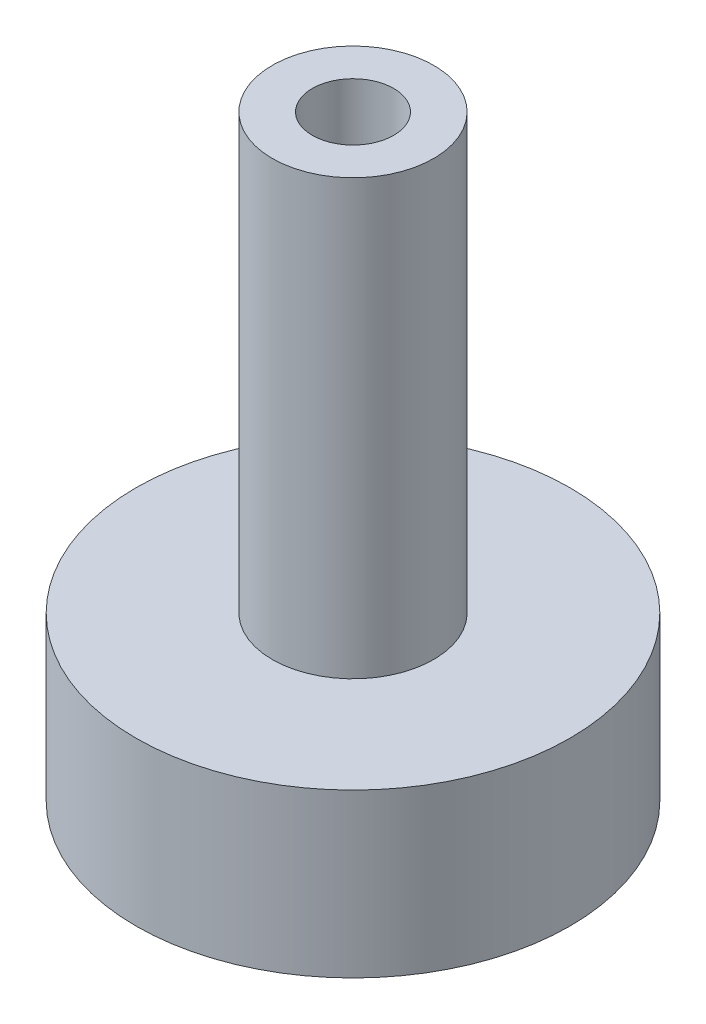
ISO-10303-21;
HEADER;
FILE_DESCRIPTION(('STEP AP214'),'2;1');
FILE_NAME('part.step','',(''),(''),'','','');
FILE_SCHEMA(('AUTOMOTIVE_DESIGN { 1 0 10303 214 1 1 1 1 }'));
ENDSEC;
DATA;
#1=APPLICATION_CONTEXT('core data for automotive mechanical design processes');
#2=APPLICATION_PROTOCOL_DEFINITION('international standard','automotive_design',2000,#1);
#3=PRODUCT_CONTEXT('',#1,'mechanical');
#4=PRODUCT('Part','Part','',(#3));
#5=PRODUCT_RELATED_PRODUCT_CATEGORY('part','',(#4));
#6=PRODUCT_DEFINITION_FORMATION('','',#4);
#7=PRODUCT_DEFINITION_CONTEXT('part definition',#1,'design');
#8=PRODUCT_DEFINITION('design','',#6,#7);
#9=PRODUCT_DEFINITION_SHAPE('','',#8);
#10=(LENGTH_UNIT() NAMED_UNIT(*) SI_UNIT(.MILLI.,.METRE.));
#11=(NAMED_UNIT(*) PLANE_ANGLE_UNIT() SI_UNIT($,.RADIAN.));
#12=(NAMED_UNIT(*) SI_UNIT($,.STERADIAN.) SOLID_ANGLE_UNIT());
#13=UNCERTAINTY_MEASURE_WITH_UNIT(LENGTH_MEASURE(1.E-05),#10,'distance_accuracy_value','');
#14=(GEOMETRIC_REPRESENTATION_CONTEXT(3) GLOBAL_UNCERTAINTY_ASSIGNED_CONTEXT((#13)) GLOBAL_UNIT_ASSIGNED_CONTEXT((#10,
#11,#12)) REPRESENTATION_CONTEXT('',''));
#15=CARTESIAN_POINT('',(0.,0.,0.));
#16=DIRECTION('',(0.,0.,1.));
#17=DIRECTION('',(1.,0.,0.));
#18=AXIS2_PLACEMENT_3D('',#15,#16,#17);
#19=CARTESIAN_POINT('',(-27.9181268796598,4.7625,5.99101435185832));
#20=DIRECTION('',(0.,-1.,0.));
#21=DIRECTION('',(0.,0.,-1.));
#22=AXIS2_PLACEMENT_3D('',#19,#20,#21);
#23=CYLINDRICAL_SURFACE('',#22,6.35);
#24=CARTESIAN_POINT('',(-27.9181268796598,4.7625,5.99101435185832));
#25=DIRECTION('',(0.,1.,0.));
#26=DIRECTION('',(0.,0.,1.));
#27=AXIS2_PLACEMENT_3D('',#24,#25,#26);
#28=CIRCLE('',#27,6.35);
#29=CARTESIAN_POINT('',(-27.9181268796598,4.7625,-0.358985648141679));
#30=VERTEX_POINT('',#29);
#31=EDGE_CURVE('E45',#30,#30,#28,.T.);
#32=CARTESIAN_POINT('',(-27.9181268796598,0.,5.99101435185832));
#33=DIRECTION('',(0.,1.,0.));
#34=DIRECTION('',(0.,0.,1.));
#35=AXIS2_PLACEMENT_3D('',#32,#33,#34);
#36=CIRCLE('',#35,6.35);
#37=CARTESIAN_POINT('',(-27.9181268796598,0.,-0.358985648141679));
#38=VERTEX_POINT('',#37);
#39=EDGE_CURVE('E40',#38,#38,#36,.T.);
#40=CARTESIAN_POINT('',(-27.9181268796598,4.7625,-0.358985648141679));
#41=CARTESIAN_POINT('',(-27.9181268796598,4.712890625,-0.358985648141679));
#42=CARTESIAN_POINT('',(-27.9181268796598,4.66328125,-0.358985648141679));
#43=CARTESIAN_POINT('',(-27.9181268796598,4.5640625,-0.358985648141679));
#44=CARTESIAN_POINT('',(-27.9181268796598,4.514453125,-0.358985648141679));
#45=CARTESIAN_POINT('',(-27.9181268796598,4.415234375,-0.358985648141679));
#46=CARTESIAN_POINT('',(-27.9181268796598,4.365625,-0.358985648141679));
#47=CARTESIAN_POINT('',(-27.9181268796598,4.26640625,-0.358985648141679));
#48=CARTESIAN_POINT('',(-27.9181268796598,4.216796875,-0.358985648141679));
#49=CARTESIAN_POINT('',(-27.9181268796598,4.117578125,-0.358985648141679));
#50=CARTESIAN_POINT('',(-27.9181268796598,4.06796875,-0.358985648141679));
#51=CARTESIAN_POINT('',(-27.9181268796598,3.96875,-0.358985648141679));
#52=CARTESIAN_POINT('',(-27.9181268796598,3.919140625,-0.358985648141679));
#53=CARTESIAN_POINT('',(-27.9181268796598,3.819921875,-0.358985648141679));
#54=CARTESIAN_POINT('',(-27.9181268796598,3.7703125,-0.358985648141679));
#55=CARTESIAN_POINT('',(-27.9181268796598,3.67109375,-0.358985648141679));
#56=CARTESIAN_POINT('',(-27.9181268796598,3.621484375,-0.358985648141679));
#57=CARTESIAN_POINT('',(-27.9181268796598,3.522265625,-0.358985648141679));
#58=CARTESIAN_POINT('',(-27.9181268796598,3.47265625,-0.358985648141679));
#59=CARTESIAN_POINT('',(-27.9181268796598,3.3734375,-0.358985648141679));
#60=CARTESIAN_POINT('',(-27.9181268796598,3.323828125,-0.358985648141679));
#61=CARTESIAN_POINT('',(-27.9181268796598,3.224609375,-0.358985648141679));
#62=CARTESIAN_POINT('',(-27.9181268796598,3.175,-0.358985648141679));
#63=CARTESIAN_POINT('',(-27.9181268796598,3.07578125,-0.358985648141679));
#64=CARTESIAN_POINT('',(-27.9181268796598,3.026171875,-0.358985648141679));
#65=CARTESIAN_POINT('',(-27.9181268796598,2.926953125,-0.358985648141679));
#66=CARTESIAN_POINT('',(-27.9181268796598,2.87734375,-0.358985648141679));
#67=CARTESIAN_POINT('',(-27.9181268796598,2.778125,-0.358985648141679));
#68=CARTESIAN_POINT('',(-27.9181268796598,2.728515625,-0.358985648141679));
#69=CARTESIAN_POINT('',(-27.9181268796598,2.629296875,-0.358985648141679));
#70=CARTESIAN_POINT('',(-27.9181268796598,2.5796875,-0.358985648141679));
#71=CARTESIAN_POINT('',(-27.9181268796598,2.48046875,-0.358985648141679));
#72=CARTESIAN_POINT('',(-27.9181268796598,2.430859375,-0.358985648141679));
#73=CARTESIAN_POINT('',(-27.9181268796598,2.331640625,-0.358985648141679));
#74=CARTESIAN_POINT('',(-27.9181268796598,2.28203125,-0.358985648141679));
#75=CARTESIAN_POINT('',(-27.9181268796598,2.1828125,-0.358985648141679));
#76=CARTESIAN_POINT('',(-27.9181268796598,2.133203125,-0.358985648141679));
#77=CARTESIAN_POINT('',(-27.9181268796598,2.033984375,-0.358985648141679));
#78=CARTESIAN_POINT('',(-27.9181268796598,1.984375,-0.358985648141679));
#79=CARTESIAN_POINT('',(-27.9181268796598,1.88515625,-0.358985648141679));
#80=CARTESIAN_POINT('',(-27.9181268796598,1.835546875,-0.358985648141679));
#81=CARTESIAN_POINT('',(-27.9181268796598,1.736328125,-0.358985648141679));
#82=CARTESIAN_POINT('',(-27.9181268796598,1.68671875,-0.358985648141679));
#83=CARTESIAN_POINT('',(-27.9181268796598,1.5875,-0.358985648141679));
#84=CARTESIAN_POINT('',(-27.9181268796598,1.537890625,-0.358985648141679));
#85=CARTESIAN_POINT('',(-27.9181268796598,1.438671875,-0.358985648141679));
#86=CARTESIAN_POINT('',(-27.9181268796598,1.3890625,-0.358985648141679));
#87=CARTESIAN_POINT('',(-27.9181268796598,1.28984375,-0.358985648141679));
#88=CARTESIAN_POINT('',(-27.9181268796598,1.240234375,-0.358985648141679));
#89=CARTESIAN_POINT('',(-27.9181268796598,1.141015625,-0.358985648141679));
#90=CARTESIAN_POINT('',(-27.9181268796598,1.09140625,-0.358985648141679));
#91=CARTESIAN_POINT('',(-27.9181268796598,0.992187499999999,-0.358985648141679));
#92=CARTESIAN_POINT('',(-27.9181268796598,0.942578124999999,-0.358985648141679));
#93=CARTESIAN_POINT('',(-27.9181268796598,0.843359375,-0.358985648141679));
#94=CARTESIAN_POINT('',(-27.9181268796598,0.79375,-0.358985648141679));
#95=CARTESIAN_POINT('',(-27.9181268796598,0.69453125,-0.358985648141679));
#96=CARTESIAN_POINT('',(-27.9181268796598,0.644921875,-0.358985648141679));
#97=CARTESIAN_POINT('',(-27.9181268796598,0.545703125,-0.358985648141679));
#98=CARTESIAN_POINT('',(-27.9181268796598,0.49609375,-0.358985648141679));
#99=CARTESIAN_POINT('',(-27.9181268796598,0.396875,-0.358985648141679));
#100=CARTESIAN_POINT('',(-27.9181268796598,0.347265625,-0.358985648141679));
#101=CARTESIAN_POINT('',(-27.9181268796598,0.248046875,-0.358985648141679));
#102=CARTESIAN_POINT('',(-27.9181268796598,0.1984375,-0.358985648141679));
#103=CARTESIAN_POINT('',(-27.9181268796598,0.09921875,-0.358985648141679));
#104=CARTESIAN_POINT('',(-27.9181268796598,0.049609375,-0.358985648141679));
#105=CARTESIAN_POINT('',(-27.9181268796598,0.,-0.358985648141679));
#106=B_SPLINE_CURVE_WITH_KNOTS('',3,(#40,#41,#42,#43,#44,#45,#46,#47,#48,#49,#50,#51,#52,#53,
#54,#55,#56,#57,#58,#59,#60,#61,#62,#63,#64,#65,#66,#67,#68,#69,#70,#71,#72,#73,#74,#75,#76,#77,
#78,#79,#80,#81,#82,#83,#84,#85,#86,#87,#88,#89,#90,#91,#92,#93,#94,#95,#96,#97,#98,#99,#100,
#101,#102,#103,#104,#105),.UNSPECIFIED.,.F.,.F.,(4,2,2,2,2,2,2,2,2,2,2,2,2,2,2,2,2,2,2,2,2,2,2,
2,2,2,2,2,2,2,2,2,4),(0.,0.148828125,0.29765625,0.446484375,0.5953125,0.744140625,
0.892968750000001,1.041796875,1.190625,1.339453125,1.48828125,1.637109375,1.7859375,1.934765625,
2.08359375,2.232421875,2.38125,2.530078125,2.67890625,2.827734375,2.9765625,3.125390625,
3.27421875,3.423046875,3.571875,3.720703125,3.86953125,4.018359375,4.1671875,4.316015625,
4.46484375,4.613671875,4.7625),.UNSPECIFIED.);
#107=EDGE_CURVE('BSEAM37',#30,#38,#106,.T.);
#108=ORIENTED_EDGE('',*,*,#31,.F.);
#109=ORIENTED_EDGE('',*,*,#39,.T.);
#110=ORIENTED_EDGE('',*,*,#107,.T.);
#111=ORIENTED_EDGE('',*,*,#107,.F.);
#112=EDGE_LOOP('',(#108,#110,#109,#111));
#113=FACE_BOUND('',#112,.T.);
#114=ADVANCED_FACE('F37',(#113),#23,.T.);
#115=CARTESIAN_POINT('',(-27.9181268796598,4.7625,5.99101435185832));
#116=DIRECTION('',(0.,1.,0.));
#117=DIRECTION('',(0.,0.,1.));
#118=AXIS2_PLACEMENT_3D('',#115,#116,#117);
#119=PLANE('',#118);
#120=CARTESIAN_POINT('',(-27.9181268796598,4.7625,5.99101435185832));
#121=DIRECTION('',(0.,1.,0.));
#122=DIRECTION('',(0.,0.,1.));
#123=AXIS2_PLACEMENT_3D('',#120,#121,#122);
#124=CIRCLE('',#123,2.3622);
#125=CARTESIAN_POINT('',(-27.9181268796598,4.7625,8.35321435185833));
#126=VERTEX_POINT('',#125);
#127=EDGE_CURVE('E55',#126,#126,#124,.F.);
#128=ORIENTED_EDGE('',*,*,#127,.T.);
#129=EDGE_LOOP('',(#128));
#130=FACE_BOUND('',#129,.T.);
#131=ORIENTED_EDGE('',*,*,#31,.T.);
#132=EDGE_LOOP('',(#131));
#133=FACE_BOUND('',#132,.T.);
#134=ADVANCED_FACE('F84',(#130,#133),#119,.T.);
#135=CARTESIAN_POINT('',(-27.9181268796598,0.,5.99101435185832));
#136=DIRECTION('',(0.,1.,0.));
#137=DIRECTION('',(0.,0.,1.));
#138=AXIS2_PLACEMENT_3D('',#135,#136,#137);
#139=PLANE('',#138);
#140=ORIENTED_EDGE('',*,*,#39,.F.);
#141=EDGE_LOOP('',(#140));
#142=FACE_BOUND('',#141,.T.);
#143=ADVANCED_FACE('F76',(#142),#139,.F.);
#144=CARTESIAN_POINT('',(-27.9181268796598,17.4625,5.99101435185832));
#145=DIRECTION('',(0.,1.,0.));
#146=DIRECTION('',(0.,0.,1.));
#147=AXIS2_PLACEMENT_3D('',#144,#145,#146);
#148=PLANE('',#147);
#149=CARTESIAN_POINT('',(-27.9181268796598,17.4625,5.99101435185832));
#150=DIRECTION('',(0.,1.,0.));
#151=DIRECTION('',(0.,0.,1.));
#152=AXIS2_PLACEMENT_3D('',#149,#150,#151);
#153=CIRCLE('',#152,2.3622);
#154=CARTESIAN_POINT('',(-27.9181268796598,17.4625,8.35321435185833));
#155=VERTEX_POINT('',#154);
#156=EDGE_CURVE('E53',#155,#155,#153,.T.);
#157=ORIENTED_EDGE('',*,*,#156,.T.);
#158=EDGE_LOOP('',(#157));
#159=FACE_BOUND('',#158,.T.);
#160=CARTESIAN_POINT('',(-27.9181268796598,17.4625,5.99101435185832));
#161=DIRECTION('',(0.,1.,0.));
#162=DIRECTION('',(0.,0.,1.));
#163=AXIS2_PLACEMENT_3D('',#160,#161,#162);
#164=CIRCLE('',#163,1.190625);
#165=CARTESIAN_POINT('',(-27.9181268796598,17.4625,7.18163935185832));
#166=VERTEX_POINT('',#165);
#167=EDGE_CURVE('E64',#166,#166,#164,.T.);
#168=ORIENTED_EDGE('',*,*,#167,.F.);
#169=EDGE_LOOP('',(#168));
#170=FACE_BOUND('',#169,.T.);
#171=ADVANCED_FACE('F73',(#159,#170),#148,.T.);
#172=CARTESIAN_POINT('',(-27.9181268796598,17.4625,5.99101435185832));
#173=DIRECTION('',(0.,-1.,0.));
#174=DIRECTION('',(0.,0.,-1.));
#175=AXIS2_PLACEMENT_3D('',#172,#173,#174);
#176=CYLINDRICAL_SURFACE('',#175,2.3622);
#177=ORIENTED_EDGE('',*,*,#127,.F.);
#178=EDGE_LOOP('',(#177));
#179=FACE_BOUND('',#178,.T.);
#180=ORIENTED_EDGE('',*,*,#156,.F.);
#181=EDGE_LOOP('',(#180));
#182=FACE_BOUND('',#181,.T.);
#183=ADVANCED_FACE('F75',(#179,#182),#176,.T.);
#184=CARTESIAN_POINT('',(-27.9181268796598,17.4625,5.99101435185832));
#185=DIRECTION('',(0.,-1.,0.));
#186=DIRECTION('',(0.,0.,-1.));
#187=AXIS2_PLACEMENT_3D('',#184,#185,#186);
#188=CYLINDRICAL_SURFACE('',#187,1.190625);
#189=CARTESIAN_POINT('',(-27.9181268796598,4.7625,5.99101435185832));
#190=DIRECTION('',(0.,1.,0.));
#191=DIRECTION('',(0.,0.,1.));
#192=AXIS2_PLACEMENT_3D('',#189,#190,#191);
#193=CIRCLE('',#192,1.190625);
#194=CARTESIAN_POINT('',(-27.9181268796598,4.7625,7.18163935185832));
#195=VERTEX_POINT('',#194);
#196=EDGE_CURVE('E10',#195,#195,#193,.F.);
#197=ORIENTED_EDGE('',*,*,#196,.T.);
#198=EDGE_LOOP('',(#197));
#199=FACE_BOUND('',#198,.T.);
#200=ORIENTED_EDGE('',*,*,#167,.T.);
#201=EDGE_LOOP('',(#200));
#202=FACE_BOUND('',#201,.T.);
#203=ADVANCED_FACE('F71',(#199,#202),#188,.F.);
#204=ORIENTED_EDGE('',*,*,#196,.F.);
#205=EDGE_LOOP('',(#204));
#206=FACE_BOUND('',#205,.T.);
#207=ADVANCED_FACE('F93',(#206),#119,.T.);
#208=CLOSED_SHELL('',(#114,#134,#143,#171,#183,#203,#207));
#209=MANIFOLD_SOLID_BREP('B2',#208);
#210=ADVANCED_BREP_SHAPE_REPRESENTATION('',(#18,#209),#14);
#211=SHAPE_DEFINITION_REPRESENTATION(#9,#210);
ENDSEC;
END-ISO-10303-21;
